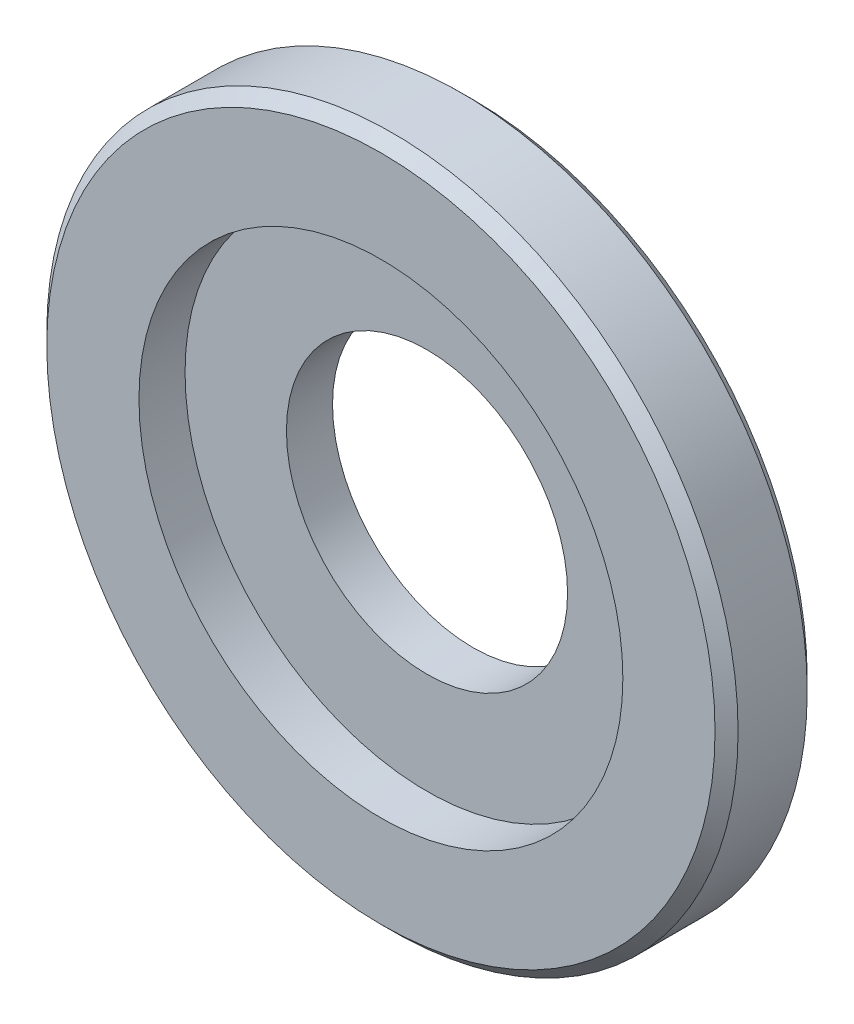
ISO-10303-21;
HEADER;
FILE_DESCRIPTION(('STEP AP214'),'2;1');
FILE_NAME('part.step','',(''),(''),'','','');
FILE_SCHEMA(('AUTOMOTIVE_DESIGN { 1 0 10303 214 1 1 1 1 }'));
ENDSEC;
DATA;
#1=APPLICATION_CONTEXT('core data for automotive mechanical design processes');
#2=APPLICATION_PROTOCOL_DEFINITION('international standard','automotive_design',2000,#1);
#3=PRODUCT_CONTEXT('',#1,'mechanical');
#4=PRODUCT('Part','Part','',(#3));
#5=PRODUCT_RELATED_PRODUCT_CATEGORY('part','',(#4));
#6=PRODUCT_DEFINITION_FORMATION('','',#4);
#7=PRODUCT_DEFINITION_CONTEXT('part definition',#1,'design');
#8=PRODUCT_DEFINITION('design','',#6,#7);
#9=PRODUCT_DEFINITION_SHAPE('','',#8);
#10=(LENGTH_UNIT() NAMED_UNIT(*) SI_UNIT(.MILLI.,.METRE.));
#11=(NAMED_UNIT(*) PLANE_ANGLE_UNIT() SI_UNIT($,.RADIAN.));
#12=(NAMED_UNIT(*) SI_UNIT($,.STERADIAN.) SOLID_ANGLE_UNIT());
#13=UNCERTAINTY_MEASURE_WITH_UNIT(LENGTH_MEASURE(1.E-05),#10,'distance_accuracy_value','');
#14=(GEOMETRIC_REPRESENTATION_CONTEXT(3) GLOBAL_UNCERTAINTY_ASSIGNED_CONTEXT((#13)) GLOBAL_UNIT_ASSIGNED_CONTEXT((#10,
#11,#12)) REPRESENTATION_CONTEXT('',''));
#15=CARTESIAN_POINT('',(0.,0.,0.));
#16=DIRECTION('',(0.,0.,1.));
#17=DIRECTION('',(1.,0.,0.));
#18=AXIS2_PLACEMENT_3D('',#15,#16,#17);
#19=CARTESIAN_POINT('',(0.,0.,4.));
#20=DIRECTION('',(0.,0.,-1.));
#21=DIRECTION('',(-1.,0.,0.));
#22=AXIS2_PLACEMENT_3D('',#19,#20,#21);
#23=CYLINDRICAL_SURFACE('',#22,6.1);
#24=CARTESIAN_POINT('',(0.,0.,0.));
#25=DIRECTION('',(0.,0.,1.));
#26=DIRECTION('',(1.,0.,0.));
#27=AXIS2_PLACEMENT_3D('',#24,#25,#26);
#28=CIRCLE('',#27,6.1);
#29=CARTESIAN_POINT('',(6.1,0.,0.));
#30=VERTEX_POINT('',#29);
#31=EDGE_CURVE('E51',#30,#30,#28,.T.);
#32=ORIENTED_EDGE('',*,*,#31,.F.);
#33=EDGE_LOOP('',(#32));
#34=FACE_BOUND('',#33,.T.);
#35=CARTESIAN_POINT('',(0.,0.,2.));
#36=DIRECTION('',(0.,0.,1.));
#37=DIRECTION('',(1.,0.,0.));
#38=AXIS2_PLACEMENT_3D('',#35,#36,#37);
#39=CIRCLE('',#38,6.1);
#40=CARTESIAN_POINT('',(6.1,0.,2.));
#41=VERTEX_POINT('',#40);
#42=EDGE_CURVE('E52',#41,#41,#39,.T.);
#43=ORIENTED_EDGE('',*,*,#42,.T.);
#44=EDGE_LOOP('',(#43));
#45=FACE_BOUND('',#44,.T.);
#46=ADVANCED_FACE('F31',(#34,#45),#23,.F.);
#47=CARTESIAN_POINT('',(0.,0.,4.));
#48=DIRECTION('',(0.,0.,1.));
#49=DIRECTION('',(1.,0.,0.));
#50=AXIS2_PLACEMENT_3D('',#47,#48,#49);
#51=PLANE('',#50);
#52=CARTESIAN_POINT('',(0.,0.,4.));
#53=DIRECTION('',(0.,0.,1.));
#54=DIRECTION('',(1.,0.,0.));
#55=AXIS2_PLACEMENT_3D('',#52,#53,#54);
#56=CIRCLE('',#55,14.5);
#57=CARTESIAN_POINT('',(14.5,0.,4.));
#58=VERTEX_POINT('',#57);
#59=EDGE_CURVE('E10',#58,#58,#56,.T.);
#60=ORIENTED_EDGE('',*,*,#59,.T.);
#61=EDGE_LOOP('',(#60));
#62=FACE_BOUND('',#61,.T.);
#63=CARTESIAN_POINT('',(0.,0.,4.));
#64=DIRECTION('',(0.,0.,1.));
#65=DIRECTION('',(1.,0.,0.));
#66=AXIS2_PLACEMENT_3D('',#63,#64,#65);
#67=CIRCLE('',#66,10.5);
#68=CARTESIAN_POINT('',(10.5,0.,4.));
#69=VERTEX_POINT('',#68);
#70=EDGE_CURVE('E58',#69,#69,#67,.T.);
#71=ORIENTED_EDGE('',*,*,#70,.F.);
#72=EDGE_LOOP('',(#71));
#73=FACE_BOUND('',#72,.T.);
#74=ADVANCED_FACE('F73',(#62,#73),#51,.T.);
#75=CARTESIAN_POINT('',(0.,0.,0.));
#76=DIRECTION('',(0.,0.,1.));
#77=DIRECTION('',(1.,0.,0.));
#78=AXIS2_PLACEMENT_3D('',#75,#76,#77);
#79=PLANE('',#78);
#80=CARTESIAN_POINT('',(0.,0.,0.));
#81=DIRECTION('',(0.,0.,1.));
#82=DIRECTION('',(1.,0.,0.));
#83=AXIS2_PLACEMENT_3D('',#80,#81,#82);
#84=CIRCLE('',#83,14.5);
#85=CARTESIAN_POINT('',(14.5,0.,0.));
#86=VERTEX_POINT('',#85);
#87=EDGE_CURVE('E38',#86,#86,#84,.F.);
#88=ORIENTED_EDGE('',*,*,#87,.T.);
#89=EDGE_LOOP('',(#88));
#90=FACE_BOUND('',#89,.T.);
#91=ORIENTED_EDGE('',*,*,#31,.T.);
#92=EDGE_LOOP('',(#91));
#93=FACE_BOUND('',#92,.T.);
#94=ADVANCED_FACE('F75',(#90,#93),#79,.F.);
#95=CARTESIAN_POINT('',(0.,0.,4.));
#96=DIRECTION('',(0.,0.,-1.));
#97=DIRECTION('',(-1.,0.,0.));
#98=AXIS2_PLACEMENT_3D('',#95,#96,#97);
#99=CYLINDRICAL_SURFACE('',#98,15.);
#100=CARTESIAN_POINT('',(0.,0.,0.500000000000006));
#101=DIRECTION('',(0.,0.,1.));
#102=DIRECTION('',(1.,0.,0.));
#103=AXIS2_PLACEMENT_3D('',#100,#101,#102);
#104=CIRCLE('',#103,15.);
#105=CARTESIAN_POINT('',(15.,0.,0.500000000000006));
#106=VERTEX_POINT('',#105);
#107=EDGE_CURVE('E42',#106,#106,#104,.T.);
#108=ORIENTED_EDGE('',*,*,#107,.T.);
#109=EDGE_LOOP('',(#108));
#110=FACE_BOUND('',#109,.T.);
#111=CARTESIAN_POINT('',(0.,0.,3.5));
#112=DIRECTION('',(0.,0.,1.));
#113=DIRECTION('',(1.,0.,0.));
#114=AXIS2_PLACEMENT_3D('',#111,#112,#113);
#115=CIRCLE('',#114,15.);
#116=CARTESIAN_POINT('',(15.,0.,3.5));
#117=VERTEX_POINT('',#116);
#118=EDGE_CURVE('E46',#117,#117,#115,.F.);
#119=ORIENTED_EDGE('',*,*,#118,.T.);
#120=EDGE_LOOP('',(#119));
#121=FACE_BOUND('',#120,.T.);
#122=ADVANCED_FACE('F69',(#110,#121),#99,.T.);
#123=CARTESIAN_POINT('',(0.,0.,2.));
#124=DIRECTION('',(0.,0.,1.));
#125=DIRECTION('',(1.,0.,0.));
#126=AXIS2_PLACEMENT_3D('',#123,#124,#125);
#127=CYLINDRICAL_SURFACE('',#126,10.5);
#128=CARTESIAN_POINT('',(0.,0.,2.));
#129=DIRECTION('',(0.,0.,1.));
#130=DIRECTION('',(1.,0.,0.));
#131=AXIS2_PLACEMENT_3D('',#128,#129,#130);
#132=CIRCLE('',#131,10.5);
#133=CARTESIAN_POINT('',(10.5,0.,2.));
#134=VERTEX_POINT('',#133);
#135=EDGE_CURVE('E55',#134,#134,#132,.T.);
#136=ORIENTED_EDGE('',*,*,#135,.F.);
#137=EDGE_LOOP('',(#136));
#138=FACE_BOUND('',#137,.T.);
#139=ORIENTED_EDGE('',*,*,#70,.T.);
#140=EDGE_LOOP('',(#139));
#141=FACE_BOUND('',#140,.T.);
#142=ADVANCED_FACE('F66',(#138,#141),#127,.F.);
#143=CARTESIAN_POINT('',(0.,0.,2.));
#144=DIRECTION('',(0.,0.,1.));
#145=DIRECTION('',(1.,0.,0.));
#146=AXIS2_PLACEMENT_3D('',#143,#144,#145);
#147=PLANE('',#146);
#148=ORIENTED_EDGE('',*,*,#42,.F.);
#149=EDGE_LOOP('',(#148));
#150=FACE_BOUND('',#149,.T.);
#151=ORIENTED_EDGE('',*,*,#135,.T.);
#152=EDGE_LOOP('',(#151));
#153=FACE_BOUND('',#152,.T.);
#154=ADVANCED_FACE('F64',(#150,#153),#147,.T.);
#155=CARTESIAN_POINT('',(0.,0.,0.500000000000006));
#156=DIRECTION('',(0.,0.,1.));
#157=DIRECTION('',(1.,0.,0.));
#158=AXIS2_PLACEMENT_3D('',#155,#156,#157);
#159=CONICAL_SURFACE('',#158,15.,0.785398163397452);
#160=ORIENTED_EDGE('',*,*,#87,.F.);
#161=EDGE_LOOP('',(#160));
#162=FACE_BOUND('',#161,.T.);
#163=ORIENTED_EDGE('',*,*,#107,.F.);
#164=EDGE_LOOP('',(#163));
#165=FACE_BOUND('',#164,.T.);
#166=ADVANCED_FACE('F87',(#162,#165),#159,.T.);
#167=CARTESIAN_POINT('',(0.,0.,4.));
#168=DIRECTION('',(0.,0.,-1.));
#169=DIRECTION('',(-1.,0.,0.));
#170=AXIS2_PLACEMENT_3D('',#167,#168,#169);
#171=CONICAL_SURFACE('',#170,14.5,0.785398163397445);
#172=ORIENTED_EDGE('',*,*,#118,.F.);
#173=EDGE_LOOP('',(#172));
#174=FACE_BOUND('',#173,.T.);
#175=ORIENTED_EDGE('',*,*,#59,.F.);
#176=EDGE_LOOP('',(#175));
#177=FACE_BOUND('',#176,.T.);
#178=ADVANCED_FACE('F33',(#174,#177),#171,.T.);
#179=CLOSED_SHELL('',(#46,#74,#94,#122,#142,#154,#166,#178));
#180=MANIFOLD_SOLID_BREP('B2',#179);
#181=ADVANCED_BREP_SHAPE_REPRESENTATION('',(#18,#180),#14);
#182=SHAPE_DEFINITION_REPRESENTATION(#9,#181);
ENDSEC;
END-ISO-10303-21;
